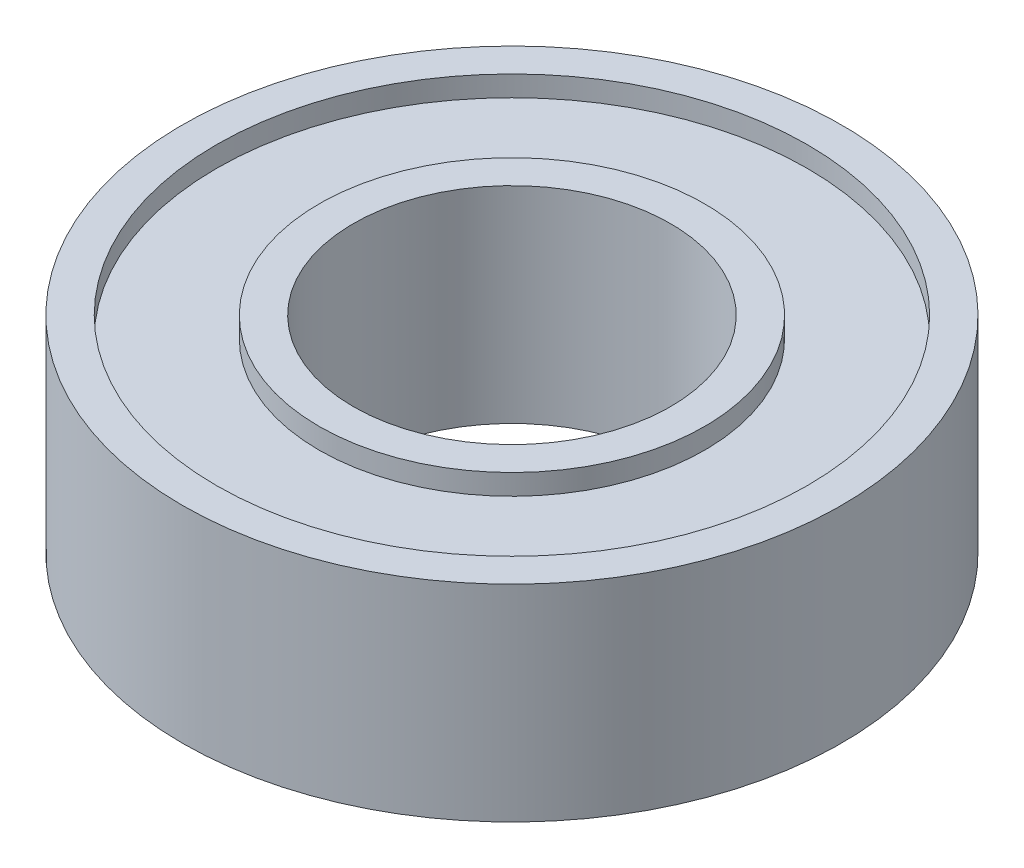
ISO-10303-21;
HEADER;
FILE_DESCRIPTION(('STEP AP214'),'2;1');
FILE_NAME('part.step','',(''),(''),'','','');
FILE_SCHEMA(('AUTOMOTIVE_DESIGN { 1 0 10303 214 1 1 1 1 }'));
ENDSEC;
DATA;
#1=APPLICATION_CONTEXT('core data for automotive mechanical design processes');
#2=APPLICATION_PROTOCOL_DEFINITION('international standard','automotive_design',2000,#1);
#3=PRODUCT_CONTEXT('',#1,'mechanical');
#4=PRODUCT('Part','Part','',(#3));
#5=PRODUCT_RELATED_PRODUCT_CATEGORY('part','',(#4));
#6=PRODUCT_DEFINITION_FORMATION('','',#4);
#7=PRODUCT_DEFINITION_CONTEXT('part definition',#1,'design');
#8=PRODUCT_DEFINITION('design','',#6,#7);
#9=PRODUCT_DEFINITION_SHAPE('','',#8);
#10=(LENGTH_UNIT() NAMED_UNIT(*) SI_UNIT(.MILLI.,.METRE.));
#11=(NAMED_UNIT(*) PLANE_ANGLE_UNIT() SI_UNIT($,.RADIAN.));
#12=(NAMED_UNIT(*) SI_UNIT($,.STERADIAN.) SOLID_ANGLE_UNIT());
#13=UNCERTAINTY_MEASURE_WITH_UNIT(LENGTH_MEASURE(1.E-05),#10,'distance_accuracy_value','');
#14=(GEOMETRIC_REPRESENTATION_CONTEXT(3) GLOBAL_UNCERTAINTY_ASSIGNED_CONTEXT((#13)) GLOBAL_UNIT_ASSIGNED_CONTEXT((#10,
#11,#12)) REPRESENTATION_CONTEXT('',''));
#15=CARTESIAN_POINT('',(0.,0.,0.));
#16=DIRECTION('',(0.,0.,1.));
#17=DIRECTION('',(1.,0.,0.));
#18=AXIS2_PLACEMENT_3D('',#15,#16,#17);
#19=CARTESIAN_POINT('',(0.,-2.5,0.));
#20=DIRECTION('',(0.,1.,0.));
#21=DIRECTION('',(0.,0.,1.));
#22=AXIS2_PLACEMENT_3D('',#19,#20,#21);
#23=PLANE('',#22);
#24=CARTESIAN_POINT('',(0.,-2.5,0.));
#25=DIRECTION('',(0.,1.,0.));
#26=DIRECTION('',(0.,0.,1.));
#27=AXIS2_PLACEMENT_3D('',#24,#25,#26);
#28=CIRCLE('',#27,3.85);
#29=CARTESIAN_POINT('',(0.,-2.5,3.85));
#30=VERTEX_POINT('',#29);
#31=EDGE_CURVE('E46',#30,#30,#28,.T.);
#32=ORIENTED_EDGE('',*,*,#31,.T.);
#33=EDGE_LOOP('',(#32));
#34=FACE_BOUND('',#33,.T.);
#35=CARTESIAN_POINT('',(0.,-2.5,0.));
#36=DIRECTION('',(0.,1.,0.));
#37=DIRECTION('',(0.,0.,1.));
#38=AXIS2_PLACEMENT_3D('',#35,#36,#37);
#39=CIRCLE('',#38,4.68);
#40=CARTESIAN_POINT('',(0.,-2.5,4.68));
#41=VERTEX_POINT('',#40);
#42=EDGE_CURVE('E70',#41,#41,#39,.T.);
#43=ORIENTED_EDGE('',*,*,#42,.F.);
#44=EDGE_LOOP('',(#43));
#45=FACE_BOUND('',#44,.T.);
#46=ADVANCED_FACE('F33',(#34,#45),#23,.F.);
#47=CARTESIAN_POINT('',(0.,2.5,0.));
#48=DIRECTION('',(0.,1.,0.));
#49=DIRECTION('',(0.,0.,1.));
#50=AXIS2_PLACEMENT_3D('',#47,#48,#49);
#51=PLANE('',#50);
#52=CARTESIAN_POINT('',(0.,2.5,0.));
#53=DIRECTION('',(0.,1.,0.));
#54=DIRECTION('',(0.,0.,1.));
#55=AXIS2_PLACEMENT_3D('',#52,#53,#54);
#56=CIRCLE('',#55,3.85);
#57=CARTESIAN_POINT('',(0.,2.5,3.85));
#58=VERTEX_POINT('',#57);
#59=EDGE_CURVE('E44',#58,#58,#56,.T.);
#60=ORIENTED_EDGE('',*,*,#59,.F.);
#61=EDGE_LOOP('',(#60));
#62=FACE_BOUND('',#61,.T.);
#63=CARTESIAN_POINT('',(0.,2.5,0.));
#64=DIRECTION('',(0.,1.,0.));
#65=DIRECTION('',(0.,0.,1.));
#66=AXIS2_PLACEMENT_3D('',#63,#64,#65);
#67=CIRCLE('',#66,4.68);
#68=CARTESIAN_POINT('',(0.,2.5,4.68));
#69=VERTEX_POINT('',#68);
#70=EDGE_CURVE('E58',#69,#69,#67,.T.);
#71=ORIENTED_EDGE('',*,*,#70,.T.);
#72=EDGE_LOOP('',(#71));
#73=FACE_BOUND('',#72,.T.);
#74=ADVANCED_FACE('F86',(#62,#73),#51,.T.);
#75=CARTESIAN_POINT('',(0.,2.5,0.));
#76=DIRECTION('',(0.,1.,0.));
#77=DIRECTION('',(0.,0.,1.));
#78=AXIS2_PLACEMENT_3D('',#75,#76,#77);
#79=CIRCLE('',#78,7.17);
#80=CARTESIAN_POINT('',(0.,2.5,7.17));
#81=VERTEX_POINT('',#80);
#82=EDGE_CURVE('E52',#81,#81,#79,.T.);
#83=ORIENTED_EDGE('',*,*,#82,.F.);
#84=EDGE_LOOP('',(#83));
#85=FACE_BOUND('',#84,.T.);
#86=CARTESIAN_POINT('',(0.,2.5,0.));
#87=DIRECTION('',(0.,1.,0.));
#88=DIRECTION('',(0.,0.,1.));
#89=AXIS2_PLACEMENT_3D('',#86,#87,#88);
#90=CIRCLE('',#89,8.);
#91=CARTESIAN_POINT('',(0.,2.5,8.));
#92=VERTEX_POINT('',#91);
#93=EDGE_CURVE('E10',#92,#92,#90,.T.);
#94=ORIENTED_EDGE('',*,*,#93,.T.);
#95=EDGE_LOOP('',(#94));
#96=FACE_BOUND('',#95,.T.);
#97=ADVANCED_FACE('F92',(#85,#96),#51,.T.);
#98=CARTESIAN_POINT('',(0.,-2.5,0.));
#99=DIRECTION('',(0.,1.,0.));
#100=DIRECTION('',(0.,0.,1.));
#101=AXIS2_PLACEMENT_3D('',#98,#99,#100);
#102=CIRCLE('',#101,7.17);
#103=CARTESIAN_POINT('',(0.,-2.5,7.17));
#104=VERTEX_POINT('',#103);
#105=EDGE_CURVE('E64',#104,#104,#102,.T.);
#106=ORIENTED_EDGE('',*,*,#105,.T.);
#107=EDGE_LOOP('',(#106));
#108=FACE_BOUND('',#107,.T.);
#109=CARTESIAN_POINT('',(0.,-2.5,0.));
#110=DIRECTION('',(0.,1.,0.));
#111=DIRECTION('',(0.,0.,1.));
#112=AXIS2_PLACEMENT_3D('',#109,#110,#111);
#113=CIRCLE('',#112,8.);
#114=CARTESIAN_POINT('',(0.,-2.5,8.));
#115=VERTEX_POINT('',#114);
#116=EDGE_CURVE('E37',#115,#115,#113,.T.);
#117=ORIENTED_EDGE('',*,*,#116,.F.);
#118=EDGE_LOOP('',(#117));
#119=FACE_BOUND('',#118,.T.);
#120=ADVANCED_FACE('F88',(#108,#119),#23,.F.);
#121=CARTESIAN_POINT('',(0.,2.5,0.));
#122=DIRECTION('',(0.,-1.,0.));
#123=DIRECTION('',(0.,0.,-1.));
#124=AXIS2_PLACEMENT_3D('',#121,#122,#123);
#125=CYLINDRICAL_SURFACE('',#124,8.);
#126=ORIENTED_EDGE('',*,*,#93,.F.);
#127=EDGE_LOOP('',(#126));
#128=FACE_BOUND('',#127,.T.);
#129=ORIENTED_EDGE('',*,*,#116,.T.);
#130=EDGE_LOOP('',(#129));
#131=FACE_BOUND('',#130,.T.);
#132=ADVANCED_FACE('F35',(#128,#131),#125,.T.);
#133=CARTESIAN_POINT('',(0.,2.5,0.));
#134=DIRECTION('',(0.,-1.,0.));
#135=DIRECTION('',(0.,0.,-1.));
#136=AXIS2_PLACEMENT_3D('',#133,#134,#135);
#137=CYLINDRICAL_SURFACE('',#136,3.85);
#138=ORIENTED_EDGE('',*,*,#59,.T.);
#139=EDGE_LOOP('',(#138));
#140=FACE_BOUND('',#139,.T.);
#141=ORIENTED_EDGE('',*,*,#31,.F.);
#142=EDGE_LOOP('',(#141));
#143=FACE_BOUND('',#142,.T.);
#144=ADVANCED_FACE('F101',(#140,#143),#137,.F.);
#145=CARTESIAN_POINT('',(0.,2.,0.));
#146=DIRECTION('',(0.,1.,0.));
#147=DIRECTION('',(0.,0.,1.));
#148=AXIS2_PLACEMENT_3D('',#145,#146,#147);
#149=CYLINDRICAL_SURFACE('',#148,7.17);
#150=CARTESIAN_POINT('',(0.,2.,0.));
#151=DIRECTION('',(0.,1.,0.));
#152=DIRECTION('',(0.,0.,1.));
#153=AXIS2_PLACEMENT_3D('',#150,#151,#152);
#154=CIRCLE('',#153,7.17);
#155=CARTESIAN_POINT('',(0.,2.,7.17));
#156=VERTEX_POINT('',#155);
#157=EDGE_CURVE('E49',#156,#156,#154,.T.);
#158=ORIENTED_EDGE('',*,*,#157,.F.);
#159=EDGE_LOOP('',(#158));
#160=FACE_BOUND('',#159,.T.);
#161=ORIENTED_EDGE('',*,*,#82,.T.);
#162=EDGE_LOOP('',(#161));
#163=FACE_BOUND('',#162,.T.);
#164=ADVANCED_FACE('F125',(#160,#163),#149,.F.);
#165=CARTESIAN_POINT('',(0.,2.,0.));
#166=DIRECTION('',(0.,1.,0.));
#167=DIRECTION('',(0.,0.,1.));
#168=AXIS2_PLACEMENT_3D('',#165,#166,#167);
#169=PLANE('',#168);
#170=CARTESIAN_POINT('',(0.,2.,0.));
#171=DIRECTION('',(0.,1.,0.));
#172=DIRECTION('',(0.,0.,1.));
#173=AXIS2_PLACEMENT_3D('',#170,#171,#172);
#174=CIRCLE('',#173,4.68);
#175=CARTESIAN_POINT('',(0.,2.,4.68));
#176=VERTEX_POINT('',#175);
#177=EDGE_CURVE('E55',#176,#176,#174,.T.);
#178=ORIENTED_EDGE('',*,*,#177,.F.);
#179=EDGE_LOOP('',(#178));
#180=FACE_BOUND('',#179,.T.);
#181=ORIENTED_EDGE('',*,*,#157,.T.);
#182=EDGE_LOOP('',(#181));
#183=FACE_BOUND('',#182,.T.);
#184=ADVANCED_FACE('F121',(#180,#183),#169,.T.);
#185=CARTESIAN_POINT('',(0.,2.,0.));
#186=DIRECTION('',(0.,1.,0.));
#187=DIRECTION('',(0.,0.,1.));
#188=AXIS2_PLACEMENT_3D('',#185,#186,#187);
#189=CYLINDRICAL_SURFACE('',#188,4.68);
#190=ORIENTED_EDGE('',*,*,#177,.T.);
#191=EDGE_LOOP('',(#190));
#192=FACE_BOUND('',#191,.T.);
#193=ORIENTED_EDGE('',*,*,#70,.F.);
#194=EDGE_LOOP('',(#193));
#195=FACE_BOUND('',#194,.T.);
#196=ADVANCED_FACE('F115',(#192,#195),#189,.T.);
#197=CARTESIAN_POINT('',(0.,-2.,0.));
#198=DIRECTION('',(0.,-1.,0.));
#199=DIRECTION('',(0.,0.,1.));
#200=AXIS2_PLACEMENT_3D('',#197,#198,#199);
#201=PLANE('',#200);
#202=CARTESIAN_POINT('',(0.,-2.,0.));
#203=DIRECTION('',(0.,1.,0.));
#204=DIRECTION('',(0.,0.,1.));
#205=AXIS2_PLACEMENT_3D('',#202,#203,#204);
#206=CIRCLE('',#205,7.17);
#207=CARTESIAN_POINT('',(0.,-2.,7.17));
#208=VERTEX_POINT('',#207);
#209=EDGE_CURVE('E61',#208,#208,#206,.T.);
#210=ORIENTED_EDGE('',*,*,#209,.F.);
#211=EDGE_LOOP('',(#210));
#212=FACE_BOUND('',#211,.T.);
#213=CARTESIAN_POINT('',(0.,-2.,0.));
#214=DIRECTION('',(0.,1.,0.));
#215=DIRECTION('',(0.,0.,1.));
#216=AXIS2_PLACEMENT_3D('',#213,#214,#215);
#217=CIRCLE('',#216,4.68);
#218=CARTESIAN_POINT('',(0.,-2.,4.68));
#219=VERTEX_POINT('',#218);
#220=EDGE_CURVE('E67',#219,#219,#217,.T.);
#221=ORIENTED_EDGE('',*,*,#220,.T.);
#222=EDGE_LOOP('',(#221));
#223=FACE_BOUND('',#222,.T.);
#224=ADVANCED_FACE('F76',(#212,#223),#201,.T.);
#225=CARTESIAN_POINT('',(0.,-2.,0.));
#226=DIRECTION('',(0.,-1.,0.));
#227=DIRECTION('',(0.,0.,-1.));
#228=AXIS2_PLACEMENT_3D('',#225,#226,#227);
#229=CYLINDRICAL_SURFACE('',#228,7.17);
#230=ORIENTED_EDGE('',*,*,#209,.T.);
#231=EDGE_LOOP('',(#230));
#232=FACE_BOUND('',#231,.T.);
#233=ORIENTED_EDGE('',*,*,#105,.F.);
#234=EDGE_LOOP('',(#233));
#235=FACE_BOUND('',#234,.T.);
#236=ADVANCED_FACE('F81',(#232,#235),#229,.F.);
#237=CARTESIAN_POINT('',(0.,-2.,0.));
#238=DIRECTION('',(0.,-1.,0.));
#239=DIRECTION('',(0.,0.,-1.));
#240=AXIS2_PLACEMENT_3D('',#237,#238,#239);
#241=CYLINDRICAL_SURFACE('',#240,4.68);
#242=ORIENTED_EDGE('',*,*,#220,.F.);
#243=EDGE_LOOP('',(#242));
#244=FACE_BOUND('',#243,.T.);
#245=ORIENTED_EDGE('',*,*,#42,.T.);
#246=EDGE_LOOP('',(#245));
#247=FACE_BOUND('',#246,.T.);
#248=ADVANCED_FACE('F78',(#244,#247),#241,.T.);
#249=CLOSED_SHELL('',(#46,#74,#97,#120,#132,#144,#164,#184,#196,#224,#236,#248));
#250=MANIFOLD_SOLID_BREP('B2',#249);
#251=ADVANCED_BREP_SHAPE_REPRESENTATION('',(#18,#250),#14);
#252=SHAPE_DEFINITION_REPRESENTATION(#9,#251);
ENDSEC;
END-ISO-10303-21;
